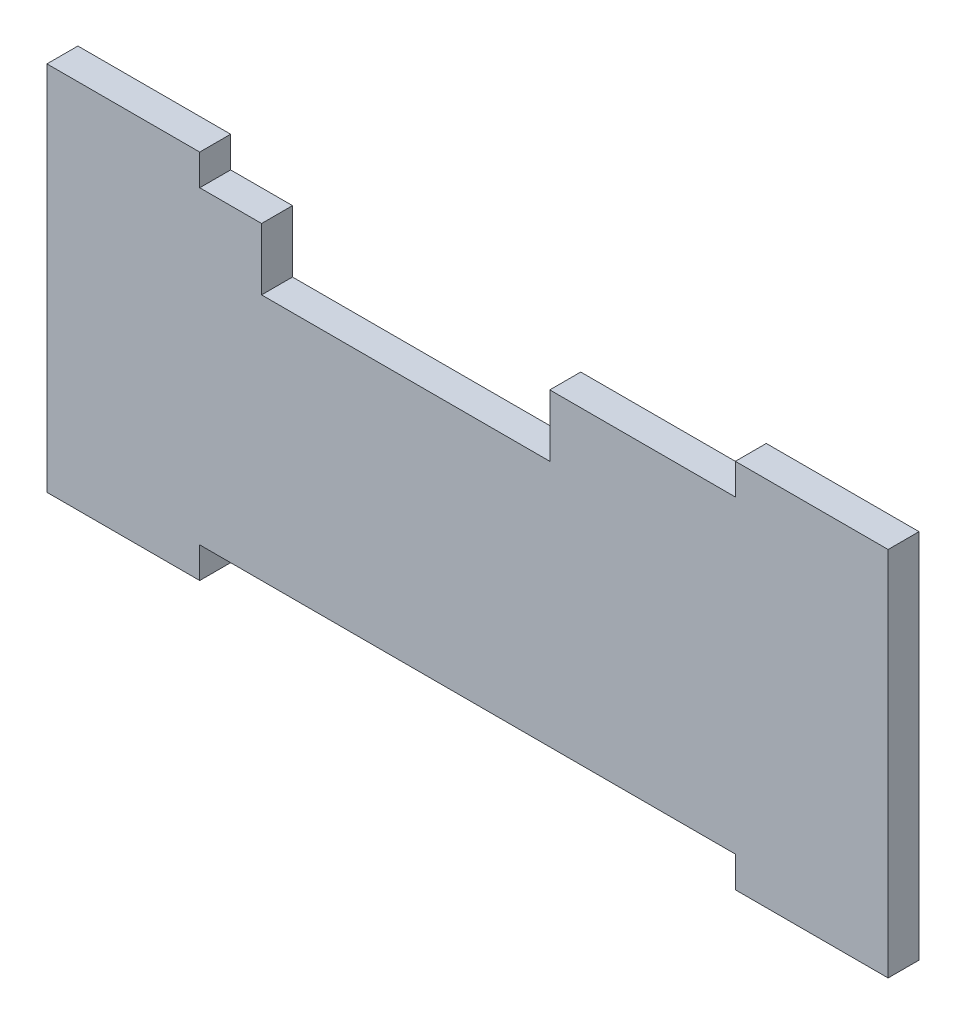
ISO-10303-21;
HEADER;
FILE_DESCRIPTION(('STEP AP214'),'2;1');
FILE_NAME('part.step','',(''),(''),'','','');
FILE_SCHEMA(('AUTOMOTIVE_DESIGN { 1 0 10303 214 1 1 1 1 }'));
ENDSEC;
DATA;
#1=APPLICATION_CONTEXT('core data for automotive mechanical design processes');
#2=APPLICATION_PROTOCOL_DEFINITION('international standard','automotive_design',2000,#1);
#3=PRODUCT_CONTEXT('',#1,'mechanical');
#4=PRODUCT('Part','Part','',(#3));
#5=PRODUCT_RELATED_PRODUCT_CATEGORY('part','',(#4));
#6=PRODUCT_DEFINITION_FORMATION('','',#4);
#7=PRODUCT_DEFINITION_CONTEXT('part definition',#1,'design');
#8=PRODUCT_DEFINITION('design','',#6,#7);
#9=PRODUCT_DEFINITION_SHAPE('','',#8);
#10=(LENGTH_UNIT() NAMED_UNIT(*) SI_UNIT(.MILLI.,.METRE.));
#11=(NAMED_UNIT(*) PLANE_ANGLE_UNIT() SI_UNIT($,.RADIAN.));
#12=(NAMED_UNIT(*) SI_UNIT($,.STERADIAN.) SOLID_ANGLE_UNIT());
#13=UNCERTAINTY_MEASURE_WITH_UNIT(LENGTH_MEASURE(1.E-05),#10,'distance_accuracy_value','');
#14=(GEOMETRIC_REPRESENTATION_CONTEXT(3) GLOBAL_UNCERTAINTY_ASSIGNED_CONTEXT((#13)) GLOBAL_UNIT_ASSIGNED_CONTEXT((#10,
#11,#12)) REPRESENTATION_CONTEXT('',''));
#15=CARTESIAN_POINT('',(0.,0.,0.));
#16=DIRECTION('',(0.,0.,1.));
#17=DIRECTION('',(1.,0.,0.));
#18=AXIS2_PLACEMENT_3D('',#15,#16,#17);
#19=CARTESIAN_POINT('',(-68.,50.,5.));
#20=DIRECTION('',(0.,-1.,0.));
#21=DIRECTION('',(0.,0.,-1.));
#22=AXIS2_PLACEMENT_3D('',#19,#20,#21);
#23=PLANE('',#22);
#24=DIRECTION('',(-1.,0.,0.));
#25=VECTOR('',#24,1.);
#26=CARTESIAN_POINT('',(-68.,50.,5.));
#27=LINE('',#26,#25);
#28=CARTESIAN_POINT('',(-33.3,50.,5.));
#29=VERTEX_POINT('',#28);
#30=CARTESIAN_POINT('',(-43.3,50.,5.));
#31=VERTEX_POINT('',#30);
#32=EDGE_CURVE('E47',#29,#31,#27,.T.);
#33=ORIENTED_EDGE('',*,*,#32,.F.);
#34=DIRECTION('',(0.,0.,1.));
#35=VECTOR('',#34,1.);
#36=CARTESIAN_POINT('',(-33.3,50.,-47.6608854302981));
#37=LINE('',#36,#35);
#38=CARTESIAN_POINT('',(-33.3,50.,0.));
#39=VERTEX_POINT('',#38);
#40=EDGE_CURVE('E167',#39,#29,#37,.T.);
#41=ORIENTED_EDGE('',*,*,#40,.F.);
#42=DIRECTION('',(-1.,0.,0.));
#43=VECTOR('',#42,1.);
#44=CARTESIAN_POINT('',(-68.,50.,0.));
#45=LINE('',#44,#43);
#46=CARTESIAN_POINT('',(-43.3,50.,0.));
#47=VERTEX_POINT('',#46);
#48=EDGE_CURVE('E268',#39,#47,#45,.T.);
#49=ORIENTED_EDGE('',*,*,#48,.T.);
#50=DIRECTION('',(0.,0.,-1.));
#51=VECTOR('',#50,1.);
#52=CARTESIAN_POINT('',(-43.3,50.,0.));
#53=LINE('',#52,#51);
#54=EDGE_CURVE('E239',#31,#47,#53,.T.);
#55=ORIENTED_EDGE('',*,*,#54,.F.);
#56=EDGE_LOOP('',(#33,#41,#49,#55));
#57=FACE_BOUND('',#56,.T.);
#58=ADVANCED_FACE('F38',(#57),#23,.F.);
#59=CARTESIAN_POINT('',(-68.,0.,5.));
#60=DIRECTION('',(0.,1.,0.));
#61=DIRECTION('',(0.,0.,1.));
#62=AXIS2_PLACEMENT_3D('',#59,#60,#61);
#63=PLANE('',#62);
#64=DIRECTION('',(0.,0.,-1.));
#65=VECTOR('',#64,1.);
#66=CARTESIAN_POINT('',(43.3,0.,5.));
#67=LINE('',#66,#65);
#68=CARTESIAN_POINT('',(43.3,0.,5.));
#69=VERTEX_POINT('',#68);
#70=CARTESIAN_POINT('',(43.3,0.,0.));
#71=VERTEX_POINT('',#70);
#72=EDGE_CURVE('E63',#69,#71,#67,.T.);
#73=ORIENTED_EDGE('',*,*,#72,.F.);
#74=DIRECTION('',(1.,0.,0.));
#75=VECTOR('',#74,1.);
#76=CARTESIAN_POINT('',(-68.,0.,5.));
#77=LINE('',#76,#75);
#78=CARTESIAN_POINT('',(-43.3,0.,5.));
#79=VERTEX_POINT('',#78);
#80=EDGE_CURVE('E261',#79,#69,#77,.T.);
#81=ORIENTED_EDGE('',*,*,#80,.F.);
#82=DIRECTION('',(0.,0.,1.));
#83=VECTOR('',#82,1.);
#84=CARTESIAN_POINT('',(-43.3,0.,5.));
#85=LINE('',#84,#83);
#86=CARTESIAN_POINT('',(-43.3,0.,0.));
#87=VERTEX_POINT('',#86);
#88=EDGE_CURVE('E201',#87,#79,#85,.T.);
#89=ORIENTED_EDGE('',*,*,#88,.F.);
#90=DIRECTION('',(1.,0.,0.));
#91=VECTOR('',#90,1.);
#92=CARTESIAN_POINT('',(-68.,0.,0.));
#93=LINE('',#92,#91);
#94=EDGE_CURVE('E266',#87,#71,#93,.T.);
#95=ORIENTED_EDGE('',*,*,#94,.T.);
#96=EDGE_LOOP('',(#73,#81,#89,#95));
#97=FACE_BOUND('',#96,.T.);
#98=ADVANCED_FACE('F310',(#97),#63,.F.);
#99=CARTESIAN_POINT('',(43.3,50.,0.));
#100=VERTEX_POINT('',#99);
#101=CARTESIAN_POINT('',(13.3,50.,0.));
#102=VERTEX_POINT('',#101);
#103=EDGE_CURVE('E42',#100,#102,#45,.T.);
#104=ORIENTED_EDGE('',*,*,#103,.T.);
#105=DIRECTION('',(0.,0.,1.));
#106=VECTOR('',#105,1.);
#107=CARTESIAN_POINT('',(13.3,50.,-47.6608854302981));
#108=LINE('',#107,#106);
#109=CARTESIAN_POINT('',(13.3,50.,5.));
#110=VERTEX_POINT('',#109);
#111=EDGE_CURVE('E178',#102,#110,#108,.T.);
#112=ORIENTED_EDGE('',*,*,#111,.T.);
#113=CARTESIAN_POINT('',(43.3,50.,5.));
#114=VERTEX_POINT('',#113);
#115=EDGE_CURVE('E11',#114,#110,#27,.T.);
#116=ORIENTED_EDGE('',*,*,#115,.F.);
#117=DIRECTION('',(0.,0.,1.));
#118=VECTOR('',#117,1.);
#119=CARTESIAN_POINT('',(43.3,50.,0.));
#120=LINE('',#119,#118);
#121=EDGE_CURVE('E220',#100,#114,#120,.T.);
#122=ORIENTED_EDGE('',*,*,#121,.F.);
#123=EDGE_LOOP('',(#104,#112,#116,#122));
#124=FACE_BOUND('',#123,.T.);
#125=ADVANCED_FACE('F279',(#124),#23,.F.);
#126=CARTESIAN_POINT('',(-68.,50.,5.));
#127=DIRECTION('',(1.,0.,0.));
#128=DIRECTION('',(0.,0.,-1.));
#129=AXIS2_PLACEMENT_3D('',#126,#127,#128);
#130=PLANE('',#129);
#131=DIRECTION('',(0.,-1.,0.));
#132=VECTOR('',#131,1.);
#133=CARTESIAN_POINT('',(-68.,50.,0.));
#134=LINE('',#133,#132);
#135=CARTESIAN_POINT('',(-68.,55.,0.));
#136=VERTEX_POINT('',#135);
#137=CARTESIAN_POINT('',(-68.,-5.,0.));
#138=VERTEX_POINT('',#137);
#139=EDGE_CURVE('E258',#136,#138,#134,.T.);
#140=ORIENTED_EDGE('',*,*,#139,.T.);
#141=DIRECTION('',(0.,0.,-1.));
#142=VECTOR('',#141,1.);
#143=CARTESIAN_POINT('',(-68.,-5.,5.));
#144=LINE('',#143,#142);
#145=CARTESIAN_POINT('',(-68.,-5.,5.));
#146=VERTEX_POINT('',#145);
#147=EDGE_CURVE('E202',#146,#138,#144,.T.);
#148=ORIENTED_EDGE('',*,*,#147,.F.);
#149=DIRECTION('',(0.,-1.,0.));
#150=VECTOR('',#149,1.);
#151=CARTESIAN_POINT('',(-68.,50.,5.));
#152=LINE('',#151,#150);
#153=CARTESIAN_POINT('',(-68.,55.,5.));
#154=VERTEX_POINT('',#153);
#155=EDGE_CURVE('E259',#154,#146,#152,.T.);
#156=ORIENTED_EDGE('',*,*,#155,.F.);
#157=DIRECTION('',(0.,0.,1.));
#158=VECTOR('',#157,1.);
#159=CARTESIAN_POINT('',(-68.,55.,0.));
#160=LINE('',#159,#158);
#161=EDGE_CURVE('E240',#136,#154,#160,.T.);
#162=ORIENTED_EDGE('',*,*,#161,.F.);
#163=EDGE_LOOP('',(#140,#148,#156,#162));
#164=FACE_BOUND('',#163,.T.);
#165=ADVANCED_FACE('F40',(#164),#130,.F.);
#166=CARTESIAN_POINT('',(68.,50.,5.));
#167=DIRECTION('',(-1.,0.,0.));
#168=DIRECTION('',(0.,0.,1.));
#169=AXIS2_PLACEMENT_3D('',#166,#167,#168);
#170=PLANE('',#169);
#171=DIRECTION('',(0.,1.,0.));
#172=VECTOR('',#171,1.);
#173=CARTESIAN_POINT('',(68.,50.,0.));
#174=LINE('',#173,#172);
#175=CARTESIAN_POINT('',(68.,-5.,0.));
#176=VERTEX_POINT('',#175);
#177=CARTESIAN_POINT('',(68.,55.,0.));
#178=VERTEX_POINT('',#177);
#179=EDGE_CURVE('E267',#176,#178,#174,.T.);
#180=ORIENTED_EDGE('',*,*,#179,.T.);
#181=DIRECTION('',(0.,0.,-1.));
#182=VECTOR('',#181,1.);
#183=CARTESIAN_POINT('',(68.,55.,0.));
#184=LINE('',#183,#182);
#185=CARTESIAN_POINT('',(68.,55.,5.));
#186=VERTEX_POINT('',#185);
#187=EDGE_CURVE('E221',#186,#178,#184,.T.);
#188=ORIENTED_EDGE('',*,*,#187,.F.);
#189=DIRECTION('',(0.,1.,0.));
#190=VECTOR('',#189,1.);
#191=CARTESIAN_POINT('',(68.,50.,5.));
#192=LINE('',#191,#190);
#193=CARTESIAN_POINT('',(68.,-5.,5.));
#194=VERTEX_POINT('',#193);
#195=EDGE_CURVE('E263',#194,#186,#192,.T.);
#196=ORIENTED_EDGE('',*,*,#195,.F.);
#197=DIRECTION('',(0.,0.,1.));
#198=VECTOR('',#197,1.);
#199=CARTESIAN_POINT('',(68.,-5.,5.));
#200=LINE('',#199,#198);
#201=EDGE_CURVE('E184',#176,#194,#200,.T.);
#202=ORIENTED_EDGE('',*,*,#201,.F.);
#203=EDGE_LOOP('',(#180,#188,#196,#202));
#204=FACE_BOUND('',#203,.T.);
#205=ADVANCED_FACE('F320',(#204),#170,.F.);
#206=CARTESIAN_POINT('',(0.,0.,5.));
#207=DIRECTION('',(0.,0.,1.));
#208=DIRECTION('',(1.,0.,0.));
#209=AXIS2_PLACEMENT_3D('',#206,#207,#208);
#210=PLANE('',#209);
#211=DIRECTION('',(0.,-1.,0.));
#212=VECTOR('',#211,1.);
#213=CARTESIAN_POINT('',(-33.3,50.,5.));
#214=LINE('',#213,#212);
#215=CARTESIAN_POINT('',(-33.3,40.,5.));
#216=VERTEX_POINT('',#215);
#217=EDGE_CURVE('E164',#29,#216,#214,.T.);
#218=ORIENTED_EDGE('',*,*,#217,.F.);
#219=ORIENTED_EDGE('',*,*,#32,.T.);
#220=DIRECTION('',(0.,-1.,0.));
#221=VECTOR('',#220,1.);
#222=CARTESIAN_POINT('',(-43.3,55.,5.));
#223=LINE('',#222,#221);
#224=CARTESIAN_POINT('',(-43.3,55.,5.));
#225=VERTEX_POINT('',#224);
#226=EDGE_CURVE('E255',#225,#31,#223,.T.);
#227=ORIENTED_EDGE('',*,*,#226,.F.);
#228=DIRECTION('',(1.,0.,0.));
#229=VECTOR('',#228,1.);
#230=CARTESIAN_POINT('',(-68.,55.,5.));
#231=LINE('',#230,#229);
#232=EDGE_CURVE('E243',#154,#225,#231,.T.);
#233=ORIENTED_EDGE('',*,*,#232,.F.);
#234=ORIENTED_EDGE('',*,*,#155,.T.);
#235=DIRECTION('',(-1.,0.,0.));
#236=VECTOR('',#235,1.);
#237=CARTESIAN_POINT('',(-68.,-5.,5.));
#238=LINE('',#237,#236);
#239=CARTESIAN_POINT('',(-43.3,-5.,5.));
#240=VERTEX_POINT('',#239);
#241=EDGE_CURVE('E209',#240,#146,#238,.T.);
#242=ORIENTED_EDGE('',*,*,#241,.F.);
#243=DIRECTION('',(0.,1.,0.));
#244=VECTOR('',#243,1.);
#245=CARTESIAN_POINT('',(-43.3,-5.,5.));
#246=LINE('',#245,#244);
#247=EDGE_CURVE('E212',#240,#79,#246,.T.);
#248=ORIENTED_EDGE('',*,*,#247,.T.);
#249=ORIENTED_EDGE('',*,*,#80,.T.);
#250=DIRECTION('',(0.,1.,0.));
#251=VECTOR('',#250,1.);
#252=CARTESIAN_POINT('',(43.3,-5.,5.));
#253=LINE('',#252,#251);
#254=CARTESIAN_POINT('',(43.3,-5.,5.));
#255=VERTEX_POINT('',#254);
#256=EDGE_CURVE('E198',#255,#69,#253,.T.);
#257=ORIENTED_EDGE('',*,*,#256,.F.);
#258=DIRECTION('',(-1.,0.,0.));
#259=VECTOR('',#258,1.);
#260=CARTESIAN_POINT('',(68.,-5.,5.));
#261=LINE('',#260,#259);
#262=EDGE_CURVE('E187',#194,#255,#261,.T.);
#263=ORIENTED_EDGE('',*,*,#262,.F.);
#264=ORIENTED_EDGE('',*,*,#195,.T.);
#265=DIRECTION('',(1.,0.,0.));
#266=VECTOR('',#265,1.);
#267=CARTESIAN_POINT('',(68.,55.,5.));
#268=LINE('',#267,#266);
#269=CARTESIAN_POINT('',(43.3,55.,5.));
#270=VERTEX_POINT('',#269);
#271=EDGE_CURVE('E228',#270,#186,#268,.T.);
#272=ORIENTED_EDGE('',*,*,#271,.F.);
#273=DIRECTION('',(0.,-1.,0.));
#274=VECTOR('',#273,1.);
#275=CARTESIAN_POINT('',(43.3,55.,5.));
#276=LINE('',#275,#274);
#277=EDGE_CURVE('E231',#270,#114,#276,.T.);
#278=ORIENTED_EDGE('',*,*,#277,.T.);
#279=ORIENTED_EDGE('',*,*,#115,.T.);
#280=DIRECTION('',(0.,1.,0.));
#281=VECTOR('',#280,1.);
#282=CARTESIAN_POINT('',(13.3,50.,5.));
#283=LINE('',#282,#281);
#284=CARTESIAN_POINT('',(13.3,40.,5.));
#285=VERTEX_POINT('',#284);
#286=EDGE_CURVE('E161',#285,#110,#283,.T.);
#287=ORIENTED_EDGE('',*,*,#286,.F.);
#288=DIRECTION('',(1.,0.,0.));
#289=VECTOR('',#288,1.);
#290=CARTESIAN_POINT('',(-33.3,40.,5.));
#291=LINE('',#290,#289);
#292=EDGE_CURVE('E155',#216,#285,#291,.T.);
#293=ORIENTED_EDGE('',*,*,#292,.F.);
#294=EDGE_LOOP('',(#218,#219,#227,#233,#234,#242,#248,#249,#257,#263,#264,#272,#278,#279,#287,#293));
#295=FACE_BOUND('',#294,.T.);
#296=ADVANCED_FACE('F171',(#295),#210,.T.);
#297=CARTESIAN_POINT('',(0.,0.,0.));
#298=DIRECTION('',(0.,0.,1.));
#299=DIRECTION('',(1.,0.,0.));
#300=AXIS2_PLACEMENT_3D('',#297,#298,#299);
#301=PLANE('',#300);
#302=ORIENTED_EDGE('',*,*,#48,.F.);
#303=DIRECTION('',(0.,1.,0.));
#304=VECTOR('',#303,1.);
#305=CARTESIAN_POINT('',(-33.3,50.,0.));
#306=LINE('',#305,#304);
#307=CARTESIAN_POINT('',(-33.3,40.,0.));
#308=VERTEX_POINT('',#307);
#309=EDGE_CURVE('E183',#308,#39,#306,.T.);
#310=ORIENTED_EDGE('',*,*,#309,.F.);
#311=DIRECTION('',(-1.,0.,0.));
#312=VECTOR('',#311,1.);
#313=CARTESIAN_POINT('',(-33.3,40.,0.));
#314=LINE('',#313,#312);
#315=CARTESIAN_POINT('',(13.3,40.,0.));
#316=VERTEX_POINT('',#315);
#317=EDGE_CURVE('E158',#316,#308,#314,.T.);
#318=ORIENTED_EDGE('',*,*,#317,.F.);
#319=DIRECTION('',(0.,-1.,0.));
#320=VECTOR('',#319,1.);
#321=CARTESIAN_POINT('',(13.3,50.,0.));
#322=LINE('',#321,#320);
#323=EDGE_CURVE('E177',#102,#316,#322,.T.);
#324=ORIENTED_EDGE('',*,*,#323,.F.);
#325=ORIENTED_EDGE('',*,*,#103,.F.);
#326=DIRECTION('',(0.,-1.,0.));
#327=VECTOR('',#326,1.);
#328=CARTESIAN_POINT('',(43.3,55.,0.));
#329=LINE('',#328,#327);
#330=CARTESIAN_POINT('',(43.3,55.,0.));
#331=VERTEX_POINT('',#330);
#332=EDGE_CURVE('E236',#331,#100,#329,.T.);
#333=ORIENTED_EDGE('',*,*,#332,.F.);
#334=DIRECTION('',(-1.,0.,0.));
#335=VECTOR('',#334,1.);
#336=CARTESIAN_POINT('',(68.,55.,0.));
#337=LINE('',#336,#335);
#338=EDGE_CURVE('E224',#178,#331,#337,.T.);
#339=ORIENTED_EDGE('',*,*,#338,.F.);
#340=ORIENTED_EDGE('',*,*,#179,.F.);
#341=DIRECTION('',(1.,0.,0.));
#342=VECTOR('',#341,1.);
#343=CARTESIAN_POINT('',(68.,-5.,0.));
#344=LINE('',#343,#342);
#345=CARTESIAN_POINT('',(43.3,-5.,0.));
#346=VERTEX_POINT('',#345);
#347=EDGE_CURVE('E191',#346,#176,#344,.T.);
#348=ORIENTED_EDGE('',*,*,#347,.F.);
#349=DIRECTION('',(0.,1.,0.));
#350=VECTOR('',#349,1.);
#351=CARTESIAN_POINT('',(43.3,-5.,0.));
#352=LINE('',#351,#350);
#353=EDGE_CURVE('E194',#346,#71,#352,.T.);
#354=ORIENTED_EDGE('',*,*,#353,.T.);
#355=ORIENTED_EDGE('',*,*,#94,.F.);
#356=DIRECTION('',(0.,1.,0.));
#357=VECTOR('',#356,1.);
#358=CARTESIAN_POINT('',(-43.3,-5.,0.));
#359=LINE('',#358,#357);
#360=CARTESIAN_POINT('',(-43.3,-5.,0.));
#361=VERTEX_POINT('',#360);
#362=EDGE_CURVE('E217',#361,#87,#359,.T.);
#363=ORIENTED_EDGE('',*,*,#362,.F.);
#364=DIRECTION('',(1.,0.,0.));
#365=VECTOR('',#364,1.);
#366=CARTESIAN_POINT('',(-68.,-5.,0.));
#367=LINE('',#366,#365);
#368=EDGE_CURVE('E205',#138,#361,#367,.T.);
#369=ORIENTED_EDGE('',*,*,#368,.F.);
#370=ORIENTED_EDGE('',*,*,#139,.F.);
#371=DIRECTION('',(-1.,0.,0.));
#372=VECTOR('',#371,1.);
#373=CARTESIAN_POINT('',(-68.,55.,0.));
#374=LINE('',#373,#372);
#375=CARTESIAN_POINT('',(-43.3,55.,0.));
#376=VERTEX_POINT('',#375);
#377=EDGE_CURVE('E247',#376,#136,#374,.T.);
#378=ORIENTED_EDGE('',*,*,#377,.F.);
#379=DIRECTION('',(0.,-1.,0.));
#380=VECTOR('',#379,1.);
#381=CARTESIAN_POINT('',(-43.3,55.,0.));
#382=LINE('',#381,#380);
#383=EDGE_CURVE('E250',#376,#47,#382,.T.);
#384=ORIENTED_EDGE('',*,*,#383,.T.);
#385=EDGE_LOOP('',(#302,#310,#318,#324,#325,#333,#339,#340,#348,#354,#355,#363,#369,#370,#378,#384));
#386=FACE_BOUND('',#385,.T.);
#387=ADVANCED_FACE('F283',(#386),#301,.F.);
#388=CARTESIAN_POINT('',(-43.3,55.,0.));
#389=DIRECTION('',(-1.,0.,0.));
#390=DIRECTION('',(0.,0.,1.));
#391=AXIS2_PLACEMENT_3D('',#388,#389,#390);
#392=PLANE('',#391);
#393=ORIENTED_EDGE('',*,*,#54,.T.);
#394=ORIENTED_EDGE('',*,*,#383,.F.);
#395=DIRECTION('',(0.,0.,-1.));
#396=VECTOR('',#395,1.);
#397=CARTESIAN_POINT('',(-43.3,55.,0.));
#398=LINE('',#397,#396);
#399=EDGE_CURVE('E245',#225,#376,#398,.T.);
#400=ORIENTED_EDGE('',*,*,#399,.F.);
#401=ORIENTED_EDGE('',*,*,#226,.T.);
#402=EDGE_LOOP('',(#393,#394,#400,#401));
#403=FACE_BOUND('',#402,.T.);
#404=ADVANCED_FACE('F291',(#403),#392,.F.);
#405=CARTESIAN_POINT('',(0.,55.,0.));
#406=DIRECTION('',(0.,1.,0.));
#407=DIRECTION('',(0.,0.,1.));
#408=AXIS2_PLACEMENT_3D('',#405,#406,#407);
#409=PLANE('',#408);
#410=ORIENTED_EDGE('',*,*,#161,.T.);
#411=ORIENTED_EDGE('',*,*,#232,.T.);
#412=ORIENTED_EDGE('',*,*,#399,.T.);
#413=ORIENTED_EDGE('',*,*,#377,.T.);
#414=EDGE_LOOP('',(#410,#411,#412,#413));
#415=FACE_BOUND('',#414,.T.);
#416=ADVANCED_FACE('F297',(#415),#409,.T.);
#417=CARTESIAN_POINT('',(43.3,55.,0.));
#418=DIRECTION('',(1.,0.,0.));
#419=DIRECTION('',(0.,0.,-1.));
#420=AXIS2_PLACEMENT_3D('',#417,#418,#419);
#421=PLANE('',#420);
#422=ORIENTED_EDGE('',*,*,#121,.T.);
#423=ORIENTED_EDGE('',*,*,#277,.F.);
#424=DIRECTION('',(0.,0.,1.));
#425=VECTOR('',#424,1.);
#426=CARTESIAN_POINT('',(43.3,55.,0.));
#427=LINE('',#426,#425);
#428=EDGE_CURVE('E226',#331,#270,#427,.T.);
#429=ORIENTED_EDGE('',*,*,#428,.F.);
#430=ORIENTED_EDGE('',*,*,#332,.T.);
#431=EDGE_LOOP('',(#422,#423,#429,#430));
#432=FACE_BOUND('',#431,.T.);
#433=ADVANCED_FACE('F325',(#432),#421,.F.);
#434=CARTESIAN_POINT('',(0.,55.,0.));
#435=DIRECTION('',(0.,-1.,0.));
#436=DIRECTION('',(0.,0.,-1.));
#437=AXIS2_PLACEMENT_3D('',#434,#435,#436);
#438=PLANE('',#437);
#439=ORIENTED_EDGE('',*,*,#187,.T.);
#440=ORIENTED_EDGE('',*,*,#338,.T.);
#441=ORIENTED_EDGE('',*,*,#428,.T.);
#442=ORIENTED_EDGE('',*,*,#271,.T.);
#443=EDGE_LOOP('',(#439,#440,#441,#442));
#444=FACE_BOUND('',#443,.T.);
#445=ADVANCED_FACE('F322',(#444),#438,.F.);
#446=CARTESIAN_POINT('',(-43.3,-5.,5.));
#447=DIRECTION('',(-1.,0.,0.));
#448=DIRECTION('',(0.,0.,1.));
#449=AXIS2_PLACEMENT_3D('',#446,#447,#448);
#450=PLANE('',#449);
#451=ORIENTED_EDGE('',*,*,#88,.T.);
#452=ORIENTED_EDGE('',*,*,#247,.F.);
#453=DIRECTION('',(0.,0.,1.));
#454=VECTOR('',#453,1.);
#455=CARTESIAN_POINT('',(-43.3,-5.,5.));
#456=LINE('',#455,#454);
#457=EDGE_CURVE('E207',#361,#240,#456,.T.);
#458=ORIENTED_EDGE('',*,*,#457,.F.);
#459=ORIENTED_EDGE('',*,*,#362,.T.);
#460=EDGE_LOOP('',(#451,#452,#458,#459));
#461=FACE_BOUND('',#460,.T.);
#462=ADVANCED_FACE('F308',(#461),#450,.F.);
#463=CARTESIAN_POINT('',(0.,-5.,0.));
#464=DIRECTION('',(0.,-1.,0.));
#465=DIRECTION('',(0.,0.,-1.));
#466=AXIS2_PLACEMENT_3D('',#463,#464,#465);
#467=PLANE('',#466);
#468=ORIENTED_EDGE('',*,*,#147,.T.);
#469=ORIENTED_EDGE('',*,*,#368,.T.);
#470=ORIENTED_EDGE('',*,*,#457,.T.);
#471=ORIENTED_EDGE('',*,*,#241,.T.);
#472=EDGE_LOOP('',(#468,#469,#470,#471));
#473=FACE_BOUND('',#472,.T.);
#474=ADVANCED_FACE('F302',(#473),#467,.T.);
#475=CARTESIAN_POINT('',(43.3,-5.,5.));
#476=DIRECTION('',(1.,0.,0.));
#477=DIRECTION('',(0.,0.,-1.));
#478=AXIS2_PLACEMENT_3D('',#475,#476,#477);
#479=PLANE('',#478);
#480=ORIENTED_EDGE('',*,*,#72,.T.);
#481=ORIENTED_EDGE('',*,*,#353,.F.);
#482=DIRECTION('',(0.,0.,-1.));
#483=VECTOR('',#482,1.);
#484=CARTESIAN_POINT('',(43.3,-5.,5.));
#485=LINE('',#484,#483);
#486=EDGE_CURVE('E189',#255,#346,#485,.T.);
#487=ORIENTED_EDGE('',*,*,#486,.F.);
#488=ORIENTED_EDGE('',*,*,#256,.T.);
#489=EDGE_LOOP('',(#480,#481,#487,#488));
#490=FACE_BOUND('',#489,.T.);
#491=ADVANCED_FACE('F315',(#490),#479,.F.);
#492=CARTESIAN_POINT('',(0.,-5.,0.));
#493=DIRECTION('',(0.,1.,0.));
#494=DIRECTION('',(0.,0.,1.));
#495=AXIS2_PLACEMENT_3D('',#492,#493,#494);
#496=PLANE('',#495);
#497=ORIENTED_EDGE('',*,*,#201,.T.);
#498=ORIENTED_EDGE('',*,*,#262,.T.);
#499=ORIENTED_EDGE('',*,*,#486,.T.);
#500=ORIENTED_EDGE('',*,*,#347,.T.);
#501=EDGE_LOOP('',(#497,#498,#499,#500));
#502=FACE_BOUND('',#501,.T.);
#503=ADVANCED_FACE('F319',(#502),#496,.F.);
#504=CARTESIAN_POINT('',(-33.3,50.,-47.6608854302981));
#505=DIRECTION('',(-1.,0.,0.));
#506=DIRECTION('',(0.,-1.,0.));
#507=AXIS2_PLACEMENT_3D('',#504,#505,#506);
#508=PLANE('',#507);
#509=ORIENTED_EDGE('',*,*,#309,.T.);
#510=ORIENTED_EDGE('',*,*,#40,.T.);
#511=ORIENTED_EDGE('',*,*,#217,.T.);
#512=DIRECTION('',(0.,0.,1.));
#513=VECTOR('',#512,1.);
#514=CARTESIAN_POINT('',(-33.3,40.,-47.6608854302981));
#515=LINE('',#514,#513);
#516=EDGE_CURVE('E151',#308,#216,#515,.T.);
#517=ORIENTED_EDGE('',*,*,#516,.F.);
#518=EDGE_LOOP('',(#509,#510,#511,#517));
#519=FACE_BOUND('',#518,.T.);
#520=ADVANCED_FACE('F165',(#519),#508,.F.);
#521=CARTESIAN_POINT('',(13.3,50.,-47.6608854302981));
#522=DIRECTION('',(1.,0.,0.));
#523=DIRECTION('',(0.,0.,-1.));
#524=AXIS2_PLACEMENT_3D('',#521,#522,#523);
#525=PLANE('',#524);
#526=ORIENTED_EDGE('',*,*,#323,.T.);
#527=DIRECTION('',(0.,0.,1.));
#528=VECTOR('',#527,1.);
#529=CARTESIAN_POINT('',(13.3,40.,-47.6608854302981));
#530=LINE('',#529,#528);
#531=EDGE_CURVE('E55',#316,#285,#530,.T.);
#532=ORIENTED_EDGE('',*,*,#531,.T.);
#533=ORIENTED_EDGE('',*,*,#286,.T.);
#534=ORIENTED_EDGE('',*,*,#111,.F.);
#535=EDGE_LOOP('',(#526,#532,#533,#534));
#536=FACE_BOUND('',#535,.T.);
#537=ADVANCED_FACE('F451',(#536),#525,.F.);
#538=CARTESIAN_POINT('',(-33.3,40.,-47.6608854302981));
#539=DIRECTION('',(0.,-1.,0.));
#540=DIRECTION('',(0.,0.,-1.));
#541=AXIS2_PLACEMENT_3D('',#538,#539,#540);
#542=PLANE('',#541);
#543=ORIENTED_EDGE('',*,*,#317,.T.);
#544=ORIENTED_EDGE('',*,*,#516,.T.);
#545=ORIENTED_EDGE('',*,*,#292,.T.);
#546=ORIENTED_EDGE('',*,*,#531,.F.);
#547=EDGE_LOOP('',(#543,#544,#545,#546));
#548=FACE_BOUND('',#547,.T.);
#549=ADVANCED_FACE('F153',(#548),#542,.F.);
#550=CLOSED_SHELL('',(#58,#98,#125,#165,#205,#296,#387,#404,#416,#433,#445,#462,#474,#491,#503,
#520,#537,#549));
#551=MANIFOLD_SOLID_BREP('B2',#550);
#552=ADVANCED_BREP_SHAPE_REPRESENTATION('',(#18,#551),#14);
#553=SHAPE_DEFINITION_REPRESENTATION(#9,#552);
ENDSEC;
END-ISO-10303-21;
